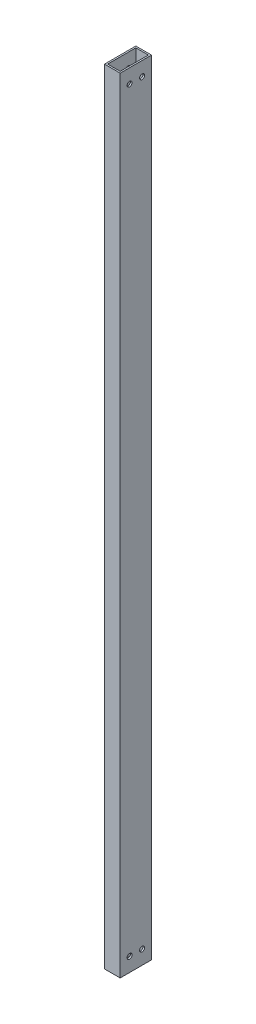
ISO-10303-21;
HEADER;
FILE_DESCRIPTION(('STEP AP214'),'2;1');
FILE_NAME('part.step','',(''),(''),'','','');
FILE_SCHEMA(('AUTOMOTIVE_DESIGN { 1 0 10303 214 1 1 1 1 }'));
ENDSEC;
DATA;
#1=APPLICATION_CONTEXT('core data for automotive mechanical design processes');
#2=APPLICATION_PROTOCOL_DEFINITION('international standard','automotive_design',2000,#1);
#3=PRODUCT_CONTEXT('',#1,'mechanical');
#4=PRODUCT('Part','Part','',(#3));
#5=PRODUCT_RELATED_PRODUCT_CATEGORY('part','',(#4));
#6=PRODUCT_DEFINITION_FORMATION('','',#4);
#7=PRODUCT_DEFINITION_CONTEXT('part definition',#1,'design');
#8=PRODUCT_DEFINITION('design','',#6,#7);
#9=PRODUCT_DEFINITION_SHAPE('','',#8);
#10=(LENGTH_UNIT() NAMED_UNIT(*) SI_UNIT(.MILLI.,.METRE.));
#11=(NAMED_UNIT(*) PLANE_ANGLE_UNIT() SI_UNIT($,.RADIAN.));
#12=(NAMED_UNIT(*) SI_UNIT($,.STERADIAN.) SOLID_ANGLE_UNIT());
#13=UNCERTAINTY_MEASURE_WITH_UNIT(LENGTH_MEASURE(1.E-05),#10,'distance_accuracy_value','');
#14=(GEOMETRIC_REPRESENTATION_CONTEXT(3) GLOBAL_UNCERTAINTY_ASSIGNED_CONTEXT((#13)) GLOBAL_UNIT_ASSIGNED_CONTEXT((#10,
#11,#12)) REPRESENTATION_CONTEXT('',''));
#15=CARTESIAN_POINT('',(0.,0.,0.));
#16=DIRECTION('',(0.,0.,1.));
#17=DIRECTION('',(1.,0.,0.));
#18=AXIS2_PLACEMENT_3D('',#15,#16,#17);
#19=CARTESIAN_POINT('',(20.,0.,0.));
#20=DIRECTION('',(0.,0.,1.));
#21=DIRECTION('',(1.,0.,0.));
#22=AXIS2_PLACEMENT_3D('',#19,#20,#21);
#23=PLANE('',#22);
#24=DIRECTION('',(0.,1.,0.));
#25=VECTOR('',#24,1.);
#26=CARTESIAN_POINT('',(0.,0.,0.));
#27=LINE('',#26,#25);
#28=CARTESIAN_POINT('',(0.,0.,0.));
#29=VERTEX_POINT('',#28);
#30=CARTESIAN_POINT('',(0.,1000.,0.));
#31=VERTEX_POINT('',#30);
#32=EDGE_CURVE('E138',#29,#31,#27,.T.);
#33=ORIENTED_EDGE('',*,*,#32,.T.);
#34=DIRECTION('',(-1.,0.,0.));
#35=VECTOR('',#34,1.);
#36=CARTESIAN_POINT('',(20.,1000.,0.));
#37=LINE('',#36,#35);
#38=CARTESIAN_POINT('',(20.,1000.,0.));
#39=VERTEX_POINT('',#38);
#40=EDGE_CURVE('E11',#39,#31,#37,.T.);
#41=ORIENTED_EDGE('',*,*,#40,.F.);
#42=DIRECTION('',(0.,1.,0.));
#43=VECTOR('',#42,1.);
#44=CARTESIAN_POINT('',(20.,0.,0.));
#45=LINE('',#44,#43);
#46=CARTESIAN_POINT('',(20.,0.,0.));
#47=VERTEX_POINT('',#46);
#48=EDGE_CURVE('E142',#47,#39,#45,.T.);
#49=ORIENTED_EDGE('',*,*,#48,.F.);
#50=DIRECTION('',(-1.,0.,0.));
#51=VECTOR('',#50,1.);
#52=CARTESIAN_POINT('',(20.,0.,0.));
#53=LINE('',#52,#51);
#54=EDGE_CURVE('E152',#47,#29,#53,.T.);
#55=ORIENTED_EDGE('',*,*,#54,.T.);
#56=EDGE_LOOP('',(#33,#41,#49,#55));
#57=FACE_BOUND('',#56,.T.);
#58=ADVANCED_FACE('F36',(#57),#23,.F.);
#59=CARTESIAN_POINT('',(20.,1000.,0.));
#60=DIRECTION('',(0.,-1.,0.));
#61=DIRECTION('',(0.,0.,-1.));
#62=AXIS2_PLACEMENT_3D('',#59,#60,#61);
#63=PLANE('',#62);
#64=DIRECTION('',(-1.,0.,0.));
#65=VECTOR('',#64,1.);
#66=CARTESIAN_POINT('',(2.,1000.,2.));
#67=LINE('',#66,#65);
#68=CARTESIAN_POINT('',(18.,1000.,2.));
#69=VERTEX_POINT('',#68);
#70=CARTESIAN_POINT('',(2.,1000.,2.));
#71=VERTEX_POINT('',#70);
#72=EDGE_CURVE('E132',#69,#71,#67,.T.);
#73=ORIENTED_EDGE('',*,*,#72,.F.);
#74=DIRECTION('',(0.,0.,-1.));
#75=VECTOR('',#74,1.);
#76=CARTESIAN_POINT('',(18.,1000.,2.));
#77=LINE('',#76,#75);
#78=CARTESIAN_POINT('',(18.,1000.,38.));
#79=VERTEX_POINT('',#78);
#80=EDGE_CURVE('E52',#79,#69,#77,.T.);
#81=ORIENTED_EDGE('',*,*,#80,.F.);
#82=DIRECTION('',(1.,0.,0.));
#83=VECTOR('',#82,1.);
#84=CARTESIAN_POINT('',(2.,1000.,38.));
#85=LINE('',#84,#83);
#86=CARTESIAN_POINT('',(2.,1000.,38.));
#87=VERTEX_POINT('',#86);
#88=EDGE_CURVE('E120',#87,#79,#85,.T.);
#89=ORIENTED_EDGE('',*,*,#88,.F.);
#90=DIRECTION('',(0.,0.,1.));
#91=VECTOR('',#90,1.);
#92=CARTESIAN_POINT('',(2.,1000.,2.));
#93=LINE('',#92,#91);
#94=EDGE_CURVE('E123',#71,#87,#93,.T.);
#95=ORIENTED_EDGE('',*,*,#94,.F.);
#96=EDGE_LOOP('',(#73,#81,#89,#95));
#97=FACE_BOUND('',#96,.T.);
#98=DIRECTION('',(0.,0.,1.));
#99=VECTOR('',#98,1.);
#100=CARTESIAN_POINT('',(0.,1000.,0.));
#101=LINE('',#100,#99);
#102=CARTESIAN_POINT('',(0.,1000.,40.));
#103=VERTEX_POINT('',#102);
#104=EDGE_CURVE('E155',#31,#103,#101,.T.);
#105=ORIENTED_EDGE('',*,*,#104,.T.);
#106=DIRECTION('',(-1.,0.,0.));
#107=VECTOR('',#106,1.);
#108=CARTESIAN_POINT('',(20.,1000.,40.));
#109=LINE('',#108,#107);
#110=CARTESIAN_POINT('',(20.,1000.,40.));
#111=VERTEX_POINT('',#110);
#112=EDGE_CURVE('E44',#111,#103,#109,.T.);
#113=ORIENTED_EDGE('',*,*,#112,.F.);
#114=DIRECTION('',(0.,0.,1.));
#115=VECTOR('',#114,1.);
#116=CARTESIAN_POINT('',(20.,1000.,0.));
#117=LINE('',#116,#115);
#118=EDGE_CURVE('E145',#39,#111,#117,.T.);
#119=ORIENTED_EDGE('',*,*,#118,.F.);
#120=ORIENTED_EDGE('',*,*,#40,.T.);
#121=EDGE_LOOP('',(#105,#113,#119,#120));
#122=FACE_BOUND('',#121,.T.);
#123=ADVANCED_FACE('F227',(#97,#122),#63,.F.);
#124=CARTESIAN_POINT('',(20.,0.,40.));
#125=DIRECTION('',(0.,0.,-1.));
#126=DIRECTION('',(-1.,0.,0.));
#127=AXIS2_PLACEMENT_3D('',#124,#125,#126);
#128=PLANE('',#127);
#129=DIRECTION('',(0.,-1.,0.));
#130=VECTOR('',#129,1.);
#131=CARTESIAN_POINT('',(0.,0.,40.));
#132=LINE('',#131,#130);
#133=CARTESIAN_POINT('',(0.,0.,40.));
#134=VERTEX_POINT('',#133);
#135=EDGE_CURVE('E157',#103,#134,#132,.T.);
#136=ORIENTED_EDGE('',*,*,#135,.T.);
#137=DIRECTION('',(-1.,0.,0.));
#138=VECTOR('',#137,1.);
#139=CARTESIAN_POINT('',(20.,0.,40.));
#140=LINE('',#139,#138);
#141=CARTESIAN_POINT('',(20.,0.,40.));
#142=VERTEX_POINT('',#141);
#143=EDGE_CURVE('E162',#142,#134,#140,.T.);
#144=ORIENTED_EDGE('',*,*,#143,.F.);
#145=DIRECTION('',(0.,-1.,0.));
#146=VECTOR('',#145,1.);
#147=CARTESIAN_POINT('',(20.,0.,40.));
#148=LINE('',#147,#146);
#149=EDGE_CURVE('E148',#111,#142,#148,.T.);
#150=ORIENTED_EDGE('',*,*,#149,.F.);
#151=ORIENTED_EDGE('',*,*,#112,.T.);
#152=EDGE_LOOP('',(#136,#144,#150,#151));
#153=FACE_BOUND('',#152,.T.);
#154=ADVANCED_FACE('F232',(#153),#128,.F.);
#155=CARTESIAN_POINT('',(20.,0.,0.));
#156=DIRECTION('',(0.,1.,0.));
#157=DIRECTION('',(0.,0.,1.));
#158=AXIS2_PLACEMENT_3D('',#155,#156,#157);
#159=PLANE('',#158);
#160=DIRECTION('',(1.,0.,0.));
#161=VECTOR('',#160,1.);
#162=CARTESIAN_POINT('',(2.,0.,38.));
#163=LINE('',#162,#161);
#164=CARTESIAN_POINT('',(2.,0.,38.));
#165=VERTEX_POINT('',#164);
#166=CARTESIAN_POINT('',(18.,0.,38.));
#167=VERTEX_POINT('',#166);
#168=EDGE_CURVE('E110',#165,#167,#163,.T.);
#169=ORIENTED_EDGE('',*,*,#168,.T.);
#170=DIRECTION('',(0.,0.,-1.));
#171=VECTOR('',#170,1.);
#172=CARTESIAN_POINT('',(18.,0.,2.));
#173=LINE('',#172,#171);
#174=CARTESIAN_POINT('',(18.,0.,2.));
#175=VERTEX_POINT('',#174);
#176=EDGE_CURVE('E104',#167,#175,#173,.T.);
#177=ORIENTED_EDGE('',*,*,#176,.T.);
#178=DIRECTION('',(-1.,0.,0.));
#179=VECTOR('',#178,1.);
#180=CARTESIAN_POINT('',(2.,0.,2.));
#181=LINE('',#180,#179);
#182=CARTESIAN_POINT('',(2.,0.,2.));
#183=VERTEX_POINT('',#182);
#184=EDGE_CURVE('E113',#175,#183,#181,.T.);
#185=ORIENTED_EDGE('',*,*,#184,.T.);
#186=DIRECTION('',(0.,0.,1.));
#187=VECTOR('',#186,1.);
#188=CARTESIAN_POINT('',(2.,0.,2.));
#189=LINE('',#188,#187);
#190=EDGE_CURVE('E60',#183,#165,#189,.T.);
#191=ORIENTED_EDGE('',*,*,#190,.T.);
#192=EDGE_LOOP('',(#169,#177,#185,#191));
#193=FACE_BOUND('',#192,.T.);
#194=DIRECTION('',(0.,0.,-1.));
#195=VECTOR('',#194,1.);
#196=CARTESIAN_POINT('',(0.,0.,0.));
#197=LINE('',#196,#195);
#198=EDGE_CURVE('E146',#134,#29,#197,.T.);
#199=ORIENTED_EDGE('',*,*,#198,.T.);
#200=ORIENTED_EDGE('',*,*,#54,.F.);
#201=DIRECTION('',(0.,0.,-1.));
#202=VECTOR('',#201,1.);
#203=CARTESIAN_POINT('',(20.,0.,0.));
#204=LINE('',#203,#202);
#205=EDGE_CURVE('E150',#142,#47,#204,.T.);
#206=ORIENTED_EDGE('',*,*,#205,.F.);
#207=ORIENTED_EDGE('',*,*,#143,.T.);
#208=EDGE_LOOP('',(#199,#200,#206,#207));
#209=FACE_BOUND('',#208,.T.);
#210=ADVANCED_FACE('F117',(#193,#209),#159,.F.);
#211=CARTESIAN_POINT('',(20.,0.,0.));
#212=DIRECTION('',(1.,0.,0.));
#213=DIRECTION('',(0.,0.,-1.));
#214=AXIS2_PLACEMENT_3D('',#211,#212,#213);
#215=PLANE('',#214);
#216=CARTESIAN_POINT('',(20.,18.,12.0000000000001));
#217=DIRECTION('',(1.,0.,0.));
#218=DIRECTION('',(0.,0.,-1.));
#219=AXIS2_PLACEMENT_3D('',#216,#217,#218);
#220=CIRCLE('',#219,3.175);
#221=CARTESIAN_POINT('',(20.,18.,8.82500000000012));
#222=VERTEX_POINT('',#221);
#223=EDGE_CURVE('E126',#222,#222,#220,.T.);
#224=ORIENTED_EDGE('',*,*,#223,.F.);
#225=EDGE_LOOP('',(#224));
#226=FACE_BOUND('',#225,.T.);
#227=CARTESIAN_POINT('',(20.,18.,28.0000000000001));
#228=DIRECTION('',(1.,0.,0.));
#229=DIRECTION('',(0.,0.,-1.));
#230=AXIS2_PLACEMENT_3D('',#227,#228,#229);
#231=CIRCLE('',#230,3.175);
#232=CARTESIAN_POINT('',(20.,18.,24.8250000000001));
#233=VERTEX_POINT('',#232);
#234=EDGE_CURVE('E183',#233,#233,#231,.T.);
#235=ORIENTED_EDGE('',*,*,#234,.F.);
#236=EDGE_LOOP('',(#235));
#237=FACE_BOUND('',#236,.T.);
#238=CARTESIAN_POINT('',(20.,982.,27.9999999999999));
#239=DIRECTION('',(1.,0.,0.));
#240=DIRECTION('',(0.,0.,-1.));
#241=AXIS2_PLACEMENT_3D('',#238,#239,#240);
#242=CIRCLE('',#241,3.17500000000008);
#243=CARTESIAN_POINT('',(20.,982.,24.8249999999998));
#244=VERTEX_POINT('',#243);
#245=EDGE_CURVE('E179',#244,#244,#242,.T.);
#246=ORIENTED_EDGE('',*,*,#245,.F.);
#247=EDGE_LOOP('',(#246));
#248=FACE_BOUND('',#247,.T.);
#249=CARTESIAN_POINT('',(20.,982.,12.));
#250=DIRECTION('',(1.,0.,0.));
#251=DIRECTION('',(0.,0.,-1.));
#252=AXIS2_PLACEMENT_3D('',#249,#250,#251);
#253=CIRCLE('',#252,3.17500000000008);
#254=CARTESIAN_POINT('',(20.,982.,8.82499999999992));
#255=VERTEX_POINT('',#254);
#256=EDGE_CURVE('E175',#255,#255,#253,.T.);
#257=ORIENTED_EDGE('',*,*,#256,.F.);
#258=EDGE_LOOP('',(#257));
#259=FACE_BOUND('',#258,.T.);
#260=ORIENTED_EDGE('',*,*,#48,.T.);
#261=ORIENTED_EDGE('',*,*,#118,.T.);
#262=ORIENTED_EDGE('',*,*,#149,.T.);
#263=ORIENTED_EDGE('',*,*,#205,.T.);
#264=EDGE_LOOP('',(#260,#261,#262,#263));
#265=FACE_BOUND('',#264,.T.);
#266=ADVANCED_FACE('F246',(#226,#237,#248,#259,#265),#215,.T.);
#267=CARTESIAN_POINT('',(0.,0.,0.));
#268=DIRECTION('',(1.,0.,0.));
#269=DIRECTION('',(0.,0.,-1.));
#270=AXIS2_PLACEMENT_3D('',#267,#268,#269);
#271=PLANE('',#270);
#272=CARTESIAN_POINT('',(0.,18.,12.0000000000001));
#273=DIRECTION('',(-1.,0.,0.));
#274=DIRECTION('',(0.,0.,-1.));
#275=AXIS2_PLACEMENT_3D('',#272,#273,#274);
#276=CIRCLE('',#275,3.175);
#277=CARTESIAN_POINT('',(0.,18.,8.82500000000012));
#278=VERTEX_POINT('',#277);
#279=EDGE_CURVE('E356',#278,#278,#276,.T.);
#280=ORIENTED_EDGE('',*,*,#279,.F.);
#281=EDGE_LOOP('',(#280));
#282=FACE_BOUND('',#281,.T.);
#283=CARTESIAN_POINT('',(0.,18.,28.0000000000001));
#284=DIRECTION('',(-1.,0.,0.));
#285=DIRECTION('',(0.,0.,-1.));
#286=AXIS2_PLACEMENT_3D('',#283,#284,#285);
#287=CIRCLE('',#286,3.175);
#288=CARTESIAN_POINT('',(0.,18.,24.8250000000001));
#289=VERTEX_POINT('',#288);
#290=EDGE_CURVE('E358',#289,#289,#287,.T.);
#291=ORIENTED_EDGE('',*,*,#290,.F.);
#292=EDGE_LOOP('',(#291));
#293=FACE_BOUND('',#292,.T.);
#294=CARTESIAN_POINT('',(0.,982.,27.9999999999999));
#295=DIRECTION('',(-1.,0.,0.));
#296=DIRECTION('',(0.,0.,1.));
#297=AXIS2_PLACEMENT_3D('',#294,#295,#296);
#298=CIRCLE('',#297,3.17500000000008);
#299=CARTESIAN_POINT('',(0.,982.,31.175));
#300=VERTEX_POINT('',#299);
#301=EDGE_CURVE('E355',#300,#300,#298,.T.);
#302=ORIENTED_EDGE('',*,*,#301,.F.);
#303=EDGE_LOOP('',(#302));
#304=FACE_BOUND('',#303,.T.);
#305=CARTESIAN_POINT('',(0.,982.,12.));
#306=DIRECTION('',(-1.,0.,0.));
#307=DIRECTION('',(0.,0.,1.));
#308=AXIS2_PLACEMENT_3D('',#305,#306,#307);
#309=CIRCLE('',#308,3.17500000000008);
#310=CARTESIAN_POINT('',(0.,982.,15.1750000000001));
#311=VERTEX_POINT('',#310);
#312=EDGE_CURVE('E171',#311,#311,#309,.T.);
#313=ORIENTED_EDGE('',*,*,#312,.F.);
#314=EDGE_LOOP('',(#313));
#315=FACE_BOUND('',#314,.T.);
#316=ORIENTED_EDGE('',*,*,#32,.F.);
#317=ORIENTED_EDGE('',*,*,#198,.F.);
#318=ORIENTED_EDGE('',*,*,#135,.F.);
#319=ORIENTED_EDGE('',*,*,#104,.F.);
#320=EDGE_LOOP('',(#316,#317,#318,#319));
#321=FACE_BOUND('',#320,.T.);
#322=ADVANCED_FACE('F240',(#282,#293,#304,#315,#321),#271,.F.);
#323=CARTESIAN_POINT('',(18.,0.,2.));
#324=DIRECTION('',(1.,0.,0.));
#325=DIRECTION('',(0.,0.,-1.));
#326=AXIS2_PLACEMENT_3D('',#323,#324,#325);
#327=PLANE('',#326);
#328=CARTESIAN_POINT('',(18.,18.,12.0000000000001));
#329=DIRECTION('',(1.,0.,0.));
#330=DIRECTION('',(0.,0.,-1.));
#331=AXIS2_PLACEMENT_3D('',#328,#329,#330);
#332=CIRCLE('',#331,3.175);
#333=CARTESIAN_POINT('',(18.,18.,8.82500000000012));
#334=VERTEX_POINT('',#333);
#335=EDGE_CURVE('E194',#334,#334,#332,.T.);
#336=ORIENTED_EDGE('',*,*,#335,.T.);
#337=EDGE_LOOP('',(#336));
#338=FACE_BOUND('',#337,.T.);
#339=CARTESIAN_POINT('',(18.,18.,28.0000000000001));
#340=DIRECTION('',(1.,0.,0.));
#341=DIRECTION('',(0.,0.,-1.));
#342=AXIS2_PLACEMENT_3D('',#339,#340,#341);
#343=CIRCLE('',#342,3.175);
#344=CARTESIAN_POINT('',(18.,18.,24.8250000000001));
#345=VERTEX_POINT('',#344);
#346=EDGE_CURVE('E178',#345,#345,#343,.T.);
#347=ORIENTED_EDGE('',*,*,#346,.T.);
#348=EDGE_LOOP('',(#347));
#349=FACE_BOUND('',#348,.T.);
#350=CARTESIAN_POINT('',(18.,982.,27.9999999999999));
#351=DIRECTION('',(1.,0.,0.));
#352=DIRECTION('',(0.,0.,-1.));
#353=AXIS2_PLACEMENT_3D('',#350,#351,#352);
#354=CIRCLE('',#353,3.17500000000008);
#355=CARTESIAN_POINT('',(18.,982.,24.8249999999998));
#356=VERTEX_POINT('',#355);
#357=EDGE_CURVE('E174',#356,#356,#354,.T.);
#358=ORIENTED_EDGE('',*,*,#357,.T.);
#359=EDGE_LOOP('',(#358));
#360=FACE_BOUND('',#359,.T.);
#361=CARTESIAN_POINT('',(18.,982.,12.));
#362=DIRECTION('',(1.,0.,0.));
#363=DIRECTION('',(0.,0.,-1.));
#364=AXIS2_PLACEMENT_3D('',#361,#362,#363);
#365=CIRCLE('',#364,3.17500000000008);
#366=CARTESIAN_POINT('',(18.,982.,8.82499999999992));
#367=VERTEX_POINT('',#366);
#368=EDGE_CURVE('E170',#367,#367,#365,.T.);
#369=ORIENTED_EDGE('',*,*,#368,.T.);
#370=EDGE_LOOP('',(#369));
#371=FACE_BOUND('',#370,.T.);
#372=ORIENTED_EDGE('',*,*,#80,.T.);
#373=DIRECTION('',(0.,1.,0.));
#374=VECTOR('',#373,1.);
#375=CARTESIAN_POINT('',(18.,0.,2.));
#376=LINE('',#375,#374);
#377=EDGE_CURVE('E100',#175,#69,#376,.T.);
#378=ORIENTED_EDGE('',*,*,#377,.F.);
#379=ORIENTED_EDGE('',*,*,#176,.F.);
#380=DIRECTION('',(0.,1.,0.));
#381=VECTOR('',#380,1.);
#382=CARTESIAN_POINT('',(18.,0.,38.));
#383=LINE('',#382,#381);
#384=EDGE_CURVE('E136',#167,#79,#383,.T.);
#385=ORIENTED_EDGE('',*,*,#384,.T.);
#386=EDGE_LOOP('',(#372,#378,#379,#385));
#387=FACE_BOUND('',#386,.T.);
#388=ADVANCED_FACE('F102',(#338,#349,#360,#371,#387),#327,.F.);
#389=CARTESIAN_POINT('',(2.,0.,38.));
#390=DIRECTION('',(0.,0.,1.));
#391=DIRECTION('',(1.,0.,0.));
#392=AXIS2_PLACEMENT_3D('',#389,#390,#391);
#393=PLANE('',#392);
#394=ORIENTED_EDGE('',*,*,#88,.T.);
#395=ORIENTED_EDGE('',*,*,#384,.F.);
#396=ORIENTED_EDGE('',*,*,#168,.F.);
#397=DIRECTION('',(0.,1.,0.));
#398=VECTOR('',#397,1.);
#399=CARTESIAN_POINT('',(2.,0.,38.));
#400=LINE('',#399,#398);
#401=EDGE_CURVE('E139',#165,#87,#400,.T.);
#402=ORIENTED_EDGE('',*,*,#401,.T.);
#403=EDGE_LOOP('',(#394,#395,#396,#402));
#404=FACE_BOUND('',#403,.T.);
#405=ADVANCED_FACE('F265',(#404),#393,.F.);
#406=CARTESIAN_POINT('',(2.,0.,2.));
#407=DIRECTION('',(-1.,0.,0.));
#408=DIRECTION('',(0.,0.,1.));
#409=AXIS2_PLACEMENT_3D('',#406,#407,#408);
#410=PLANE('',#409);
#411=CARTESIAN_POINT('',(2.,18.,12.0000000000001));
#412=DIRECTION('',(-1.,0.,0.));
#413=DIRECTION('',(0.,0.,1.));
#414=AXIS2_PLACEMENT_3D('',#411,#412,#413);
#415=CIRCLE('',#414,3.175);
#416=CARTESIAN_POINT('',(2.,18.,15.1750000000001));
#417=VERTEX_POINT('',#416);
#418=EDGE_CURVE('E39',#417,#417,#415,.T.);
#419=ORIENTED_EDGE('',*,*,#418,.T.);
#420=EDGE_LOOP('',(#419));
#421=FACE_BOUND('',#420,.T.);
#422=CARTESIAN_POINT('',(2.,18.,28.0000000000001));
#423=DIRECTION('',(-1.,0.,0.));
#424=DIRECTION('',(0.,0.,1.));
#425=AXIS2_PLACEMENT_3D('',#422,#423,#424);
#426=CIRCLE('',#425,3.175);
#427=CARTESIAN_POINT('',(2.,18.,31.1750000000001));
#428=VERTEX_POINT('',#427);
#429=EDGE_CURVE('E176',#428,#428,#426,.T.);
#430=ORIENTED_EDGE('',*,*,#429,.T.);
#431=EDGE_LOOP('',(#430));
#432=FACE_BOUND('',#431,.T.);
#433=CARTESIAN_POINT('',(2.,982.,27.9999999999999));
#434=DIRECTION('',(-1.,0.,0.));
#435=DIRECTION('',(0.,0.,1.));
#436=AXIS2_PLACEMENT_3D('',#433,#434,#435);
#437=CIRCLE('',#436,3.17500000000008);
#438=CARTESIAN_POINT('',(2.,982.,31.175));
#439=VERTEX_POINT('',#438);
#440=EDGE_CURVE('E172',#439,#439,#437,.T.);
#441=ORIENTED_EDGE('',*,*,#440,.T.);
#442=EDGE_LOOP('',(#441));
#443=FACE_BOUND('',#442,.T.);
#444=CARTESIAN_POINT('',(2.,982.,12.));
#445=DIRECTION('',(-1.,0.,0.));
#446=DIRECTION('',(0.,0.,1.));
#447=AXIS2_PLACEMENT_3D('',#444,#445,#446);
#448=CIRCLE('',#447,3.17500000000008);
#449=CARTESIAN_POINT('',(2.,982.,15.1750000000001));
#450=VERTEX_POINT('',#449);
#451=EDGE_CURVE('E167',#450,#450,#448,.T.);
#452=ORIENTED_EDGE('',*,*,#451,.T.);
#453=EDGE_LOOP('',(#452));
#454=FACE_BOUND('',#453,.T.);
#455=ORIENTED_EDGE('',*,*,#94,.T.);
#456=ORIENTED_EDGE('',*,*,#401,.F.);
#457=ORIENTED_EDGE('',*,*,#190,.F.);
#458=DIRECTION('',(0.,1.,0.));
#459=VECTOR('',#458,1.);
#460=CARTESIAN_POINT('',(2.,0.,2.));
#461=LINE('',#460,#459);
#462=EDGE_CURVE('E109',#183,#71,#461,.T.);
#463=ORIENTED_EDGE('',*,*,#462,.T.);
#464=EDGE_LOOP('',(#455,#456,#457,#463));
#465=FACE_BOUND('',#464,.T.);
#466=ADVANCED_FACE('F202',(#421,#432,#443,#454,#465),#410,.F.);
#467=CARTESIAN_POINT('',(2.,0.,2.));
#468=DIRECTION('',(0.,0.,-1.));
#469=DIRECTION('',(-1.,0.,0.));
#470=AXIS2_PLACEMENT_3D('',#467,#468,#469);
#471=PLANE('',#470);
#472=ORIENTED_EDGE('',*,*,#72,.T.);
#473=ORIENTED_EDGE('',*,*,#462,.F.);
#474=ORIENTED_EDGE('',*,*,#184,.F.);
#475=ORIENTED_EDGE('',*,*,#377,.T.);
#476=EDGE_LOOP('',(#472,#473,#474,#475));
#477=FACE_BOUND('',#476,.T.);
#478=ADVANCED_FACE('F114',(#477),#471,.F.);
#479=CARTESIAN_POINT('',(1000.,982.,12.));
#480=DIRECTION('',(-1.,0.,0.));
#481=DIRECTION('',(0.,0.,1.));
#482=AXIS2_PLACEMENT_3D('',#479,#480,#481);
#483=CYLINDRICAL_SURFACE('',#482,3.17500000000008);
#484=ORIENTED_EDGE('',*,*,#312,.T.);
#485=EDGE_LOOP('',(#484));
#486=FACE_BOUND('',#485,.T.);
#487=ORIENTED_EDGE('',*,*,#451,.F.);
#488=EDGE_LOOP('',(#487));
#489=FACE_BOUND('',#488,.T.);
#490=ADVANCED_FACE('F218',(#486,#489),#483,.F.);
#491=CARTESIAN_POINT('',(1000.,982.,27.9999999999999));
#492=DIRECTION('',(-1.,0.,0.));
#493=DIRECTION('',(0.,0.,1.));
#494=AXIS2_PLACEMENT_3D('',#491,#492,#493);
#495=CYLINDRICAL_SURFACE('',#494,3.17500000000008);
#496=ORIENTED_EDGE('',*,*,#301,.T.);
#497=EDGE_LOOP('',(#496));
#498=FACE_BOUND('',#497,.T.);
#499=ORIENTED_EDGE('',*,*,#440,.F.);
#500=EDGE_LOOP('',(#499));
#501=FACE_BOUND('',#500,.T.);
#502=ADVANCED_FACE('F219',(#498,#501),#495,.F.);
#503=CARTESIAN_POINT('',(1000.,18.,28.0000000000001));
#504=DIRECTION('',(-1.,0.,0.));
#505=DIRECTION('',(0.,0.,1.));
#506=AXIS2_PLACEMENT_3D('',#503,#504,#505);
#507=CYLINDRICAL_SURFACE('',#506,3.175);
#508=ORIENTED_EDGE('',*,*,#290,.T.);
#509=EDGE_LOOP('',(#508));
#510=FACE_BOUND('',#509,.T.);
#511=ORIENTED_EDGE('',*,*,#429,.F.);
#512=EDGE_LOOP('',(#511));
#513=FACE_BOUND('',#512,.T.);
#514=ADVANCED_FACE('F207',(#510,#513),#507,.F.);
#515=CARTESIAN_POINT('',(1000.,18.,12.0000000000001));
#516=DIRECTION('',(-1.,0.,0.));
#517=DIRECTION('',(0.,0.,1.));
#518=AXIS2_PLACEMENT_3D('',#515,#516,#517);
#519=CYLINDRICAL_SURFACE('',#518,3.175);
#520=ORIENTED_EDGE('',*,*,#279,.T.);
#521=EDGE_LOOP('',(#520));
#522=FACE_BOUND('',#521,.T.);
#523=ORIENTED_EDGE('',*,*,#418,.F.);
#524=EDGE_LOOP('',(#523));
#525=FACE_BOUND('',#524,.T.);
#526=ADVANCED_FACE('F204',(#522,#525),#519,.F.);
#527=ORIENTED_EDGE('',*,*,#256,.T.);
#528=EDGE_LOOP('',(#527));
#529=FACE_BOUND('',#528,.T.);
#530=ORIENTED_EDGE('',*,*,#368,.F.);
#531=EDGE_LOOP('',(#530));
#532=FACE_BOUND('',#531,.T.);
#533=ADVANCED_FACE('F206',(#529,#532),#483,.F.);
#534=ORIENTED_EDGE('',*,*,#245,.T.);
#535=EDGE_LOOP('',(#534));
#536=FACE_BOUND('',#535,.T.);
#537=ORIENTED_EDGE('',*,*,#357,.F.);
#538=EDGE_LOOP('',(#537));
#539=FACE_BOUND('',#538,.T.);
#540=ADVANCED_FACE('F215',(#536,#539),#495,.F.);
#541=ORIENTED_EDGE('',*,*,#234,.T.);
#542=EDGE_LOOP('',(#541));
#543=FACE_BOUND('',#542,.T.);
#544=ORIENTED_EDGE('',*,*,#346,.F.);
#545=EDGE_LOOP('',(#544));
#546=FACE_BOUND('',#545,.T.);
#547=ADVANCED_FACE('F222',(#543,#546),#507,.F.);
#548=ORIENTED_EDGE('',*,*,#223,.T.);
#549=EDGE_LOOP('',(#548));
#550=FACE_BOUND('',#549,.T.);
#551=ORIENTED_EDGE('',*,*,#335,.F.);
#552=EDGE_LOOP('',(#551));
#553=FACE_BOUND('',#552,.T.);
#554=ADVANCED_FACE('F210',(#550,#553),#519,.F.);
#555=CLOSED_SHELL('',(#58,#123,#154,#210,#266,#322,#388,#405,#466,#478,#490,#502,#514,#526,#533,
#540,#547,#554));
#556=MANIFOLD_SOLID_BREP('B2',#555);
#557=ADVANCED_BREP_SHAPE_REPRESENTATION('',(#18,#556),#14);
#558=SHAPE_DEFINITION_REPRESENTATION(#9,#557);
ENDSEC;
END-ISO-10303-21;
